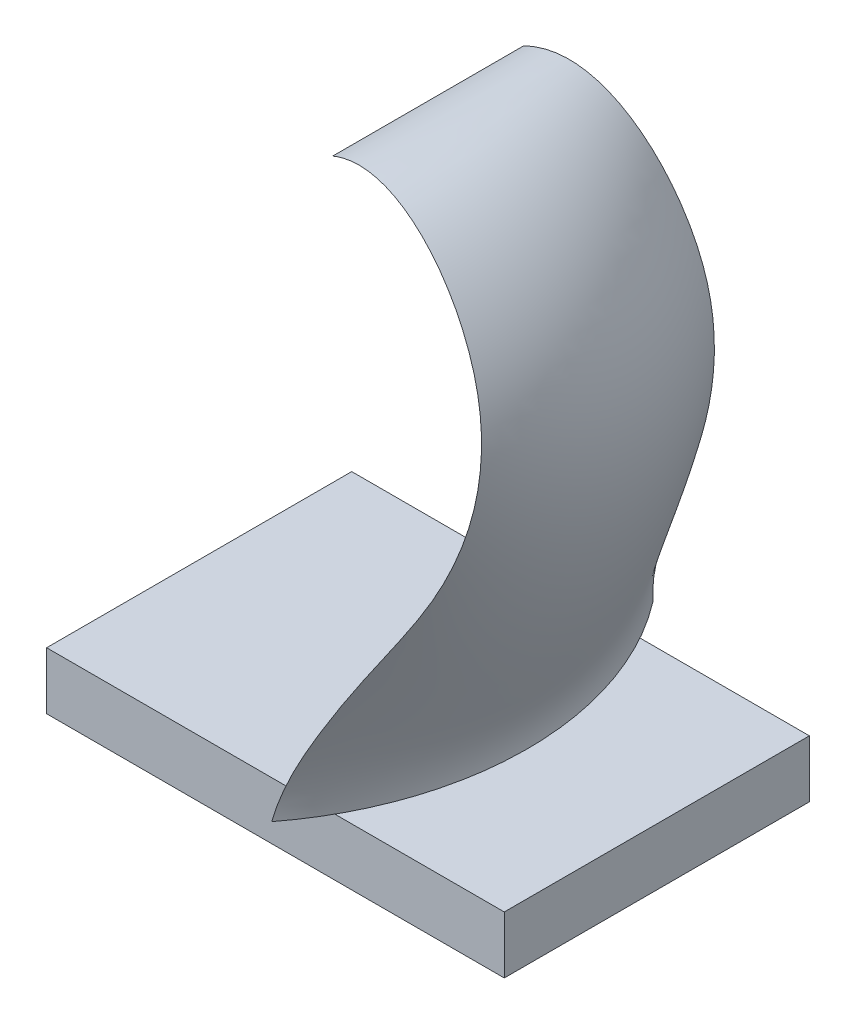
ISO-10303-21;
HEADER;
FILE_DESCRIPTION(('STEP AP214'),'2;1');
FILE_NAME('part.step','',(''),(''),'','','');
FILE_SCHEMA(('AUTOMOTIVE_DESIGN { 1 0 10303 214 1 1 1 1 }'));
ENDSEC;
DATA;
#1=APPLICATION_CONTEXT('core data for automotive mechanical design processes');
#2=APPLICATION_PROTOCOL_DEFINITION('international standard','automotive_design',2000,#1);
#3=PRODUCT_CONTEXT('',#1,'mechanical');
#4=PRODUCT('Part','Part','',(#3));
#5=PRODUCT_RELATED_PRODUCT_CATEGORY('part','',(#4));
#6=PRODUCT_DEFINITION_FORMATION('','',#4);
#7=PRODUCT_DEFINITION_CONTEXT('part definition',#1,'design');
#8=PRODUCT_DEFINITION('design','',#6,#7);
#9=PRODUCT_DEFINITION_SHAPE('','',#8);
#10=(LENGTH_UNIT() NAMED_UNIT(*) SI_UNIT(.MILLI.,.METRE.));
#11=(NAMED_UNIT(*) PLANE_ANGLE_UNIT() SI_UNIT($,.RADIAN.));
#12=(NAMED_UNIT(*) SI_UNIT($,.STERADIAN.) SOLID_ANGLE_UNIT());
#13=UNCERTAINTY_MEASURE_WITH_UNIT(LENGTH_MEASURE(1.E-05),#10,'distance_accuracy_value','');
#14=(GEOMETRIC_REPRESENTATION_CONTEXT(3) GLOBAL_UNCERTAINTY_ASSIGNED_CONTEXT((#13)) GLOBAL_UNIT_ASSIGNED_CONTEXT((#10,
#11,#12)) REPRESENTATION_CONTEXT('',''));
#15=CARTESIAN_POINT('',(0.,0.,0.));
#16=DIRECTION('',(0.,0.,1.));
#17=DIRECTION('',(1.,0.,0.));
#18=AXIS2_PLACEMENT_3D('',#15,#16,#17);
#19=CARTESIAN_POINT('',(22.86,38.1,-127.));
#20=CARTESIAN_POINT('',(25.7407617940945,57.8222835615973,-123.038269265865));
#21=CARTESIAN_POINT('',(35.1823208304503,77.9181600439821,-118.814625375902));
#22=CARTESIAN_POINT('',(63.0083787503413,132.464269578733,-105.055951773524));
#23=CARTESIAN_POINT('',(95.4842782472564,177.188970186548,-83.5655710372944));
#24=CARTESIAN_POINT('',(118.378186816913,251.812260443803,-78.4937866658445));
#25=CARTESIAN_POINT('',(99.5735610920073,345.989099781604,-71.7268857831782));
#26=CARTESIAN_POINT('',(46.8262666073439,400.833740154441,-67.3881374632275));
#27=CARTESIAN_POINT('',(0.,378.826250501208,-63.5));
#28=CARTESIAN_POINT('',(29.7971316674873,38.1,-117.97764816658));
#29=CARTESIAN_POINT('',(32.2168979798733,56.8522951636508,-114.2847936075));
#30=CARTESIAN_POINT('',(41.1669847581976,75.9140565470406,-110.347801509426));
#31=CARTESIAN_POINT('',(67.7669471283308,128.669436951468,-97.5207270921764));
#32=CARTESIAN_POINT('',(99.7314729394683,176.505445371543,-77.47729847339));
#33=CARTESIAN_POINT('',(121.704072495452,252.095753668843,-72.4993406940384));
#34=CARTESIAN_POINT('',(101.495891689638,346.653206137272,-65.9807662422758));
#35=CARTESIAN_POINT('',(47.7347860411056,401.147605798026,-61.8816902231875));
#36=CARTESIAN_POINT('',(0.,378.826250501208,-58.2083333333333));
#37=CARTESIAN_POINT('',(42.1898621619863,38.1,-98.7939406373856));
#38=CARTESIAN_POINT('',(43.7842757330063,55.1202198241443,-95.6833043027778));
#39=CARTESIAN_POINT('',(51.8544450466984,72.3353969958335,-92.3670213370115));
#40=CARTESIAN_POINT('',(76.2573561452493,121.895474509339,-81.5590709133701));
#41=CARTESIAN_POINT('',(107.296326484534,175.299663249017,-64.6587125168203));
#42=CARTESIAN_POINT('',(127.590097382334,252.597029533459,-60.1065995612013));
#43=CARTESIAN_POINT('',(104.874834197013,347.826130397047,-54.3155451306361));
#44=CARTESIAN_POINT('',(49.3317199593912,401.701945663214,-50.7870420967837));
#45=CARTESIAN_POINT('',(0.,378.826250501209,-47.625));
#46=CARTESIAN_POINT('',(55.8347467675671,38.1,-67.3708139009729));
#47=CARTESIAN_POINT('',(56.5177853246743,53.2142189137034,-65.2375196642915));
#48=CARTESIAN_POINT('',(63.6163279006349,68.3973879455445,-62.9631916564288));
#49=CARTESIAN_POINT('',(85.5904583230485,114.444688779511,-55.5488929841944));
#50=CARTESIAN_POINT('',(115.592857198489,173.994125403645,-43.9471780451764));
#51=CARTESIAN_POINT('',(133.991174083558,253.141555378344,-40.5922866173068));
#52=CARTESIAN_POINT('',(108.516089920919,349.098207049184,-36.427527678188));
#53=CARTESIAN_POINT('',(51.0526266507494,402.303146289747,-33.9606628291879));
#54=CARTESIAN_POINT('',(0.,378.826250501207,-31.75));
#55=CARTESIAN_POINT('',(64.1712385527815,38.1,-34.1428336056352));
#56=CARTESIAN_POINT('',(64.296407487178,52.050161713104,-33.0580920571684));
#57=CARTESIAN_POINT('',(70.8001992379358,65.9923168010853,-31.9016373860078));
#58=CARTESIAN_POINT('',(91.2865266569546,109.895604239513,-28.1309565093425));
#59=CARTESIAN_POINT('',(120.648578022509,173.205331966367,-22.2282766795149));
#60=CARTESIAN_POINT('',(137.87018165843,253.471292218604,-20.4534684593603));
#61=CARTESIAN_POINT('',(110.709229602738,349.86766286931,-18.278964121058));
#62=CARTESIAN_POINT('',(52.0891341195178,402.666801514748,-17.0111459494737));
#63=CARTESIAN_POINT('',(0.,378.826250501209,-15.875));
#64=CARTESIAN_POINT('',(66.04,38.1,-11.3809766003659));
#65=CARTESIAN_POINT('',(66.04,51.7892659463139,-11.0193945659788));
#66=CARTESIAN_POINT('',(72.4103477989966,65.453277241779,-10.6339080569889));
#67=CARTESIAN_POINT('',(92.5627392458018,108.876180255497,-9.37700902236078));
#68=CARTESIAN_POINT('',(121.780488206978,173.029458596571,-7.40944011959209));
#69=CARTESIAN_POINT('',(138.736323726323,253.544893425226,-6.81782875131077));
#70=CARTESIAN_POINT('',(111.197489821789,350.039321427385,-6.09298812663583));
#71=CARTESIAN_POINT('',(52.319892501186,402.747929670422,-5.67038202393648));
#72=CARTESIAN_POINT('',(0.,378.826250501208,-5.29166666666667));
#73=CARTESIAN_POINT('',(66.04,38.1,11.3809766003659));
#74=CARTESIAN_POINT('',(66.04,51.7892659463139,11.0193945659788));
#75=CARTESIAN_POINT('',(72.4103477989966,65.453277241779,10.6339080569888));
#76=CARTESIAN_POINT('',(92.5627392458018,108.876180255497,9.37700902236076));
#77=CARTESIAN_POINT('',(121.780488206978,173.029458596571,7.40944011959207));
#78=CARTESIAN_POINT('',(138.736323726323,253.544893425226,6.81782875131076));
#79=CARTESIAN_POINT('',(111.197489821789,350.039321427385,6.09298812663581));
#80=CARTESIAN_POINT('',(52.319892501186,402.747929670422,5.67038202393646));
#81=CARTESIAN_POINT('',(0.,378.826250501208,5.29166666666666));
#82=CARTESIAN_POINT('',(64.1712385527816,38.1,34.1428336056354));
#83=CARTESIAN_POINT('',(64.2964074871781,52.0501617131043,33.0580920571685));
#84=CARTESIAN_POINT('',(70.8001992379359,65.9923168010859,31.9016373860077));
#85=CARTESIAN_POINT('',(91.2865266569547,109.895604239514,28.1309565093422));
#86=CARTESIAN_POINT('',(120.648578022509,173.205331966365,22.2282766795151));
#87=CARTESIAN_POINT('',(137.87018165843,253.471292218603,20.4534684593603));
#88=CARTESIAN_POINT('',(110.709229602738,349.86766286931,18.2789641210578));
#89=CARTESIAN_POINT('',(52.0891341195177,402.666801514747,17.0111459494736));
#90=CARTESIAN_POINT('',(0.,378.826250501208,15.875));
#91=CARTESIAN_POINT('',(55.834746767567,38.1,67.3708139009728));
#92=CARTESIAN_POINT('',(56.5177853246742,53.2142189137031,65.2375196642914));
#93=CARTESIAN_POINT('',(63.6163279006348,68.397387945544,62.9631916564287));
#94=CARTESIAN_POINT('',(85.5904583230483,114.44468877951,55.5488929841944));
#95=CARTESIAN_POINT('',(115.592857198489,173.994125403646,43.947178045176));
#96=CARTESIAN_POINT('',(133.991174083559,253.141555378346,40.5922866173067));
#97=CARTESIAN_POINT('',(108.51608992092,349.098207049185,36.4275276781881));
#98=CARTESIAN_POINT('',(51.0526266507495,402.303146289748,33.9606628291879));
#99=CARTESIAN_POINT('',(0.,378.826250501208,31.75));
#100=CARTESIAN_POINT('',(42.1898621619864,38.1,98.7939406373856));
#101=CARTESIAN_POINT('',(43.7842757330065,55.1202198241445,95.6833043027777));
#102=CARTESIAN_POINT('',(51.8544450466986,72.3353969958338,92.3670213370114));
#103=CARTESIAN_POINT('',(76.2573561452495,121.89547450934,81.5590709133699));
#104=CARTESIAN_POINT('',(107.296326484534,175.299663249016,64.6587125168205));
#105=CARTESIAN_POINT('',(127.590097382334,252.597029533458,60.1065995612011));
#106=CARTESIAN_POINT('',(104.874834197013,347.826130397047,54.3155451306357));
#107=CARTESIAN_POINT('',(49.3317199593912,401.701945663213,50.7870420967835));
#108=CARTESIAN_POINT('',(0.,378.826250501208,47.625));
#109=CARTESIAN_POINT('',(29.7971316674873,38.1,117.97764816658));
#110=CARTESIAN_POINT('',(32.2168979798734,56.8522951636508,114.284793607499));
#111=CARTESIAN_POINT('',(41.1669847581977,75.9140565470406,110.347801509426));
#112=CARTESIAN_POINT('',(67.7669471283309,128.669436951468,97.5207270921762));
#113=CARTESIAN_POINT('',(99.7314729394685,176.505445371543,77.4772984733897));
#114=CARTESIAN_POINT('',(121.704072495452,252.095753668843,72.4993406940382));
#115=CARTESIAN_POINT('',(101.495891689638,346.653206137272,65.9807662422757));
#116=CARTESIAN_POINT('',(47.7347860411056,401.147605798026,61.8816902231875));
#117=CARTESIAN_POINT('',(0.,378.826250501208,58.2083333333333));
#118=CARTESIAN_POINT('',(22.86,38.1,127.));
#119=CARTESIAN_POINT('',(25.7407617940946,57.8222835615972,123.038269265865));
#120=CARTESIAN_POINT('',(35.1823208304504,77.918160043982,118.814625375902));
#121=CARTESIAN_POINT('',(63.0083787503414,132.464269578733,105.055951773524));
#122=CARTESIAN_POINT('',(95.4842782472566,177.188970186548,83.565571037294));
#123=CARTESIAN_POINT('',(118.378186816913,251.812260443803,78.4937866658443));
#124=CARTESIAN_POINT('',(99.5735610920074,345.989099781604,71.7268857831781));
#125=CARTESIAN_POINT('',(46.8262666073439,400.833740154441,67.3881374632274));
#126=CARTESIAN_POINT('',(0.,378.826250501208,63.5));
#127=B_SPLINE_SURFACE_WITH_KNOTS('',3,3,((#19,#20,#21,#22,#23,#24,#25,#26,#27),(#28,#29,#30,#31,
#32,#33,#34,#35,#36),(#37,#38,#39,#40,#41,#42,#43,#44,#45),(#46,#47,#48,#49,#50,#51,#52,#53,
#54),(#55,#56,#57,#58,#59,#60,#61,#62,#63),(#64,#65,#66,#67,#68,#69,#70,#71,#72),(#73,#74,#75,
#76,#77,#78,#79,#80,#81),(#82,#83,#84,#85,#86,#87,#88,#89,#90),(#91,#92,#93,#94,#95,#96,#97,#98,
#99),(#100,#101,#102,#103,#104,#105,#106,#107,#108),(#109,#110,#111,#112,#113,#114,#115,#116,
#117),(#118,#119,#120,#121,#122,#123,#124,#125,#126)),.UNSPECIFIED.,.F.,.F.,.F.,(4,1,1,1,2,1,1,
1,4),(4,1,1,1,1,1,4),(0.,0.125,0.25,0.375,0.5,0.625,0.75,0.875,1.),(0.,0.0945431214005427,
0.100793442017874,0.326232308231561,0.596216596024091,0.638152466044383,1.),.UNSPECIFIED.);
#128=CARTESIAN_POINT('',(22.86,38.1,-127.));
#129=CARTESIAN_POINT('',(29.7971316674873,38.1,-117.97764816658));
#130=CARTESIAN_POINT('',(42.1898621619863,38.1,-98.7939406373856));
#131=CARTESIAN_POINT('',(55.8347467675671,38.1,-67.3708139009729));
#132=CARTESIAN_POINT('',(64.1712385527815,38.1,-34.1428336056352));
#133=CARTESIAN_POINT('',(66.04,38.1,-11.3809766003659));
#134=CARTESIAN_POINT('',(66.04,38.1,11.3809766003659));
#135=CARTESIAN_POINT('',(64.1712385527816,38.1,34.1428336056354));
#136=CARTESIAN_POINT('',(55.834746767567,38.1,67.3708139009728));
#137=CARTESIAN_POINT('',(42.1898621619864,38.1,98.7939406373856));
#138=CARTESIAN_POINT('',(29.7971316674873,38.1,117.97764816658));
#139=CARTESIAN_POINT('',(22.86,38.1,127.));
#140=B_SPLINE_CURVE_WITH_KNOTS('',3,(#128,#129,#130,#131,#132,#133,#134,#135,#136,#137,#138,
#139),.UNSPECIFIED.,.F.,.F.,(4,1,1,1,2,1,1,1,4),(0.,0.125,0.25,0.375,0.5,0.625,0.75,0.875,1.),.UNSPECIFIED.);
#141=CARTESIAN_POINT('',(22.86,38.1,-127.));
#142=VERTEX_POINT('',#141);
#143=CARTESIAN_POINT('',(22.86,38.1,127.));
#144=VERTEX_POINT('',#143);
#145=EDGE_CURVE('E14',#142,#144,#140,.T.);
#146=CARTESIAN_POINT('',(22.86,38.1,127.));
#147=CARTESIAN_POINT('',(25.7407617940946,57.8222835615972,123.038269265865));
#148=CARTESIAN_POINT('',(35.1823208304504,77.918160043982,118.814625375902));
#149=CARTESIAN_POINT('',(63.0083787503414,132.464269578733,105.055951773524));
#150=CARTESIAN_POINT('',(95.4842782472566,177.188970186548,83.565571037294));
#151=CARTESIAN_POINT('',(118.378186816913,251.812260443803,78.4937866658443));
#152=CARTESIAN_POINT('',(99.5735610920074,345.989099781604,71.7268857831781));
#153=CARTESIAN_POINT('',(46.8262666073439,400.833740154441,67.3881374632274));
#154=CARTESIAN_POINT('',(0.,378.826250501208,63.5));
#155=B_SPLINE_CURVE_WITH_KNOTS('',3,(#146,#147,#148,#149,#150,#151,#152,#153,#154),
.UNSPECIFIED.,.F.,.F.,(4,1,1,1,1,1,4),(0.,0.0945431214005427,0.100793442017874,
0.326232308231561,0.596216596024091,0.638152466044383,1.),.UNSPECIFIED.);
#156=CARTESIAN_POINT('',(0.,378.826250501208,63.5));
#157=VERTEX_POINT('',#156);
#158=EDGE_CURVE('E107',#144,#157,#155,.T.);
#159=DIRECTION('',(0.,0.,-1.));
#160=VECTOR('',#159,1.);
#161=CARTESIAN_POINT('',(0.,378.826250501208,0.));
#162=LINE('',#161,#160);
#163=CARTESIAN_POINT('',(0.,378.826250501208,-63.5));
#164=VERTEX_POINT('',#163);
#165=EDGE_CURVE('E101',#157,#164,#162,.T.);
#166=CARTESIAN_POINT('',(22.86,38.1,-127.));
#167=CARTESIAN_POINT('',(25.7407617940945,57.8222835615973,-123.038269265865));
#168=CARTESIAN_POINT('',(35.1823208304503,77.9181600439821,-118.814625375902));
#169=CARTESIAN_POINT('',(63.0083787503413,132.464269578733,-105.055951773524));
#170=CARTESIAN_POINT('',(95.4842782472564,177.188970186548,-83.5655710372944));
#171=CARTESIAN_POINT('',(118.378186816913,251.812260443803,-78.4937866658445));
#172=CARTESIAN_POINT('',(99.5735610920073,345.989099781604,-71.7268857831782));
#173=CARTESIAN_POINT('',(46.8262666073439,400.833740154441,-67.3881374632275));
#174=CARTESIAN_POINT('',(0.,378.826250501208,-63.5));
#175=B_SPLINE_CURVE_WITH_KNOTS('',3,(#166,#167,#168,#169,#170,#171,#172,#173,#174),
.UNSPECIFIED.,.F.,.F.,(4,1,1,1,1,1,4),(0.,0.0945431214005427,0.100793442017874,
0.326232308231561,0.596216596024091,0.638152466044383,1.),.UNSPECIFIED.);
#176=EDGE_CURVE('E120',#164,#142,#175,.F.);
#177=ORIENTED_EDGE('',*,*,#145,.T.);
#178=ORIENTED_EDGE('',*,*,#158,.T.);
#179=ORIENTED_EDGE('',*,*,#165,.T.);
#180=ORIENTED_EDGE('',*,*,#176,.T.);
#181=EDGE_LOOP('',(#177,#178,#179,#180));
#182=FACE_BOUND('',#181,.T.);
#183=ADVANCED_FACE('F98',(#182),#127,.T.);
#184=OPEN_SHELL('',(#183));
#185=SHELL_BASED_SURFACE_MODEL('B2',(#184));
#186=CARTESIAN_POINT('',(-152.4,38.1,101.6));
#187=DIRECTION('',(0.,0.,-1.));
#188=DIRECTION('',(-1.,0.,0.));
#189=AXIS2_PLACEMENT_3D('',#186,#187,#188);
#190=PLANE('',#189);
#191=DIRECTION('',(1.,0.,0.));
#192=VECTOR('',#191,1.);
#193=CARTESIAN_POINT('',(-152.4,0.,101.6));
#194=LINE('',#193,#192);
#195=CARTESIAN_POINT('',(-152.4,0.,101.6));
#196=VERTEX_POINT('',#195);
#197=CARTESIAN_POINT('',(152.4,0.,101.6));
#198=VERTEX_POINT('',#197);
#199=EDGE_CURVE('E306',#196,#198,#194,.T.);
#200=ORIENTED_EDGE('',*,*,#199,.T.);
#201=DIRECTION('',(0.,-1.,0.));
#202=VECTOR('',#201,1.);
#203=CARTESIAN_POINT('',(152.4,38.1,101.6));
#204=LINE('',#203,#202);
#205=CARTESIAN_POINT('',(152.4,38.1,101.6));
#206=VERTEX_POINT('',#205);
#207=EDGE_CURVE('E171',#206,#198,#204,.T.);
#208=ORIENTED_EDGE('',*,*,#207,.F.);
#209=DIRECTION('',(1.,0.,0.));
#210=VECTOR('',#209,1.);
#211=CARTESIAN_POINT('',(-152.4,38.1,101.6));
#212=LINE('',#211,#210);
#213=CARTESIAN_POINT('',(-152.4,38.1,101.6));
#214=VERTEX_POINT('',#213);
#215=EDGE_CURVE('E283',#214,#206,#212,.T.);
#216=ORIENTED_EDGE('',*,*,#215,.F.);
#217=DIRECTION('',(0.,-1.,0.));
#218=VECTOR('',#217,1.);
#219=CARTESIAN_POINT('',(-152.4,38.1,101.6));
#220=LINE('',#219,#218);
#221=EDGE_CURVE('E302',#214,#196,#220,.T.);
#222=ORIENTED_EDGE('',*,*,#221,.T.);
#223=EDGE_LOOP('',(#200,#208,#216,#222));
#224=FACE_BOUND('',#223,.T.);
#225=ADVANCED_FACE('F244',(#224),#190,.F.);
#226=CARTESIAN_POINT('',(152.4,38.1,-101.6));
#227=DIRECTION('',(1.,0.,0.));
#228=DIRECTION('',(0.,0.,-1.));
#229=AXIS2_PLACEMENT_3D('',#226,#227,#228);
#230=PLANE('',#229);
#231=DIRECTION('',(0.,0.,1.));
#232=VECTOR('',#231,1.);
#233=CARTESIAN_POINT('',(152.4,0.,-101.6));
#234=LINE('',#233,#232);
#235=CARTESIAN_POINT('',(152.4,0.,-101.6));
#236=VERTEX_POINT('',#235);
#237=EDGE_CURVE('E292',#236,#198,#234,.T.);
#238=ORIENTED_EDGE('',*,*,#237,.F.);
#239=DIRECTION('',(0.,-1.,0.));
#240=VECTOR('',#239,1.);
#241=CARTESIAN_POINT('',(152.4,38.1,-101.6));
#242=LINE('',#241,#240);
#243=CARTESIAN_POINT('',(152.4,38.1,-101.6));
#244=VERTEX_POINT('',#243);
#245=EDGE_CURVE('E252',#244,#236,#242,.T.);
#246=ORIENTED_EDGE('',*,*,#245,.F.);
#247=DIRECTION('',(0.,0.,1.));
#248=VECTOR('',#247,1.);
#249=CARTESIAN_POINT('',(152.4,38.1,-101.6));
#250=LINE('',#249,#248);
#251=EDGE_CURVE('E290',#244,#206,#250,.T.);
#252=ORIENTED_EDGE('',*,*,#251,.T.);
#253=ORIENTED_EDGE('',*,*,#207,.T.);
#254=EDGE_LOOP('',(#238,#246,#252,#253));
#255=FACE_BOUND('',#254,.T.);
#256=ADVANCED_FACE('F289',(#255),#230,.T.);
#257=CARTESIAN_POINT('',(-152.4,38.1,-101.6));
#258=DIRECTION('',(0.,0.,-1.));
#259=DIRECTION('',(-1.,0.,0.));
#260=AXIS2_PLACEMENT_3D('',#257,#258,#259);
#261=PLANE('',#260);
#262=DIRECTION('',(1.,0.,0.));
#263=VECTOR('',#262,1.);
#264=CARTESIAN_POINT('',(-152.4,0.,-101.6));
#265=LINE('',#264,#263);
#266=CARTESIAN_POINT('',(-152.4,0.,-101.6));
#267=VERTEX_POINT('',#266);
#268=EDGE_CURVE('E310',#267,#236,#265,.T.);
#269=ORIENTED_EDGE('',*,*,#268,.F.);
#270=DIRECTION('',(0.,-1.,0.));
#271=VECTOR('',#270,1.);
#272=CARTESIAN_POINT('',(-152.4,38.1,-101.6));
#273=LINE('',#272,#271);
#274=CARTESIAN_POINT('',(-152.4,38.1,-101.6));
#275=VERTEX_POINT('',#274);
#276=EDGE_CURVE('E275',#275,#267,#273,.T.);
#277=ORIENTED_EDGE('',*,*,#276,.F.);
#278=DIRECTION('',(1.,0.,0.));
#279=VECTOR('',#278,1.);
#280=CARTESIAN_POINT('',(-152.4,38.1,-101.6));
#281=LINE('',#280,#279);
#282=EDGE_CURVE('E298',#275,#244,#281,.T.);
#283=ORIENTED_EDGE('',*,*,#282,.T.);
#284=ORIENTED_EDGE('',*,*,#245,.T.);
#285=EDGE_LOOP('',(#269,#277,#283,#284));
#286=FACE_BOUND('',#285,.T.);
#287=ADVANCED_FACE('F300',(#286),#261,.T.);
#288=CARTESIAN_POINT('',(-152.4,38.1,-101.6));
#289=DIRECTION('',(1.,0.,0.));
#290=DIRECTION('',(0.,0.,-1.));
#291=AXIS2_PLACEMENT_3D('',#288,#289,#290);
#292=PLANE('',#291);
#293=DIRECTION('',(0.,0.,1.));
#294=VECTOR('',#293,1.);
#295=CARTESIAN_POINT('',(-152.4,0.,-101.6));
#296=LINE('',#295,#294);
#297=EDGE_CURVE('E278',#267,#196,#296,.T.);
#298=ORIENTED_EDGE('',*,*,#297,.T.);
#299=ORIENTED_EDGE('',*,*,#221,.F.);
#300=DIRECTION('',(0.,0.,1.));
#301=VECTOR('',#300,1.);
#302=CARTESIAN_POINT('',(-152.4,38.1,-101.6));
#303=LINE('',#302,#301);
#304=EDGE_CURVE('E260',#275,#214,#303,.T.);
#305=ORIENTED_EDGE('',*,*,#304,.F.);
#306=ORIENTED_EDGE('',*,*,#276,.T.);
#307=EDGE_LOOP('',(#298,#299,#305,#306));
#308=FACE_BOUND('',#307,.T.);
#309=ADVANCED_FACE('F323',(#308),#292,.F.);
#310=CARTESIAN_POINT('',(0.,38.1,0.));
#311=DIRECTION('',(0.,-1.,0.));
#312=DIRECTION('',(0.,0.,-1.));
#313=AXIS2_PLACEMENT_3D('',#310,#311,#312);
#314=PLANE('',#313);
#315=ORIENTED_EDGE('',*,*,#215,.T.);
#316=ORIENTED_EDGE('',*,*,#251,.F.);
#317=ORIENTED_EDGE('',*,*,#282,.F.);
#318=ORIENTED_EDGE('',*,*,#304,.T.);
#319=EDGE_LOOP('',(#315,#316,#317,#318));
#320=FACE_BOUND('',#319,.T.);
#321=ADVANCED_FACE('F297',(#320),#314,.F.);
#322=CARTESIAN_POINT('',(0.,0.,0.));
#323=DIRECTION('',(0.,-1.,0.));
#324=DIRECTION('',(0.,0.,-1.));
#325=AXIS2_PLACEMENT_3D('',#322,#323,#324);
#326=PLANE('',#325);
#327=ORIENTED_EDGE('',*,*,#199,.F.);
#328=ORIENTED_EDGE('',*,*,#297,.F.);
#329=ORIENTED_EDGE('',*,*,#268,.T.);
#330=ORIENTED_EDGE('',*,*,#237,.T.);
#331=EDGE_LOOP('',(#327,#328,#329,#330));
#332=FACE_BOUND('',#331,.T.);
#333=ADVANCED_FACE('F317',(#332),#326,.T.);
#334=CLOSED_SHELL('',(#225,#256,#287,#309,#321,#333));
#335=MANIFOLD_SOLID_BREP('B90',#334);
#336=ADVANCED_BREP_SHAPE_REPRESENTATION('',(#18,#335),#14);
#337=MANIFOLD_SURFACE_SHAPE_REPRESENTATION('',(#18,#185),#14);
#338=SHAPE_REPRESENTATION('',(#18),#14);
#339=SHAPE_DEFINITION_REPRESENTATION(#9,#338);
#340=SHAPE_REPRESENTATION_RELATIONSHIP('','',#338,#336);
#341=SHAPE_REPRESENTATION_RELATIONSHIP('','',#338,#337);
ENDSEC;
END-ISO-10303-21;
